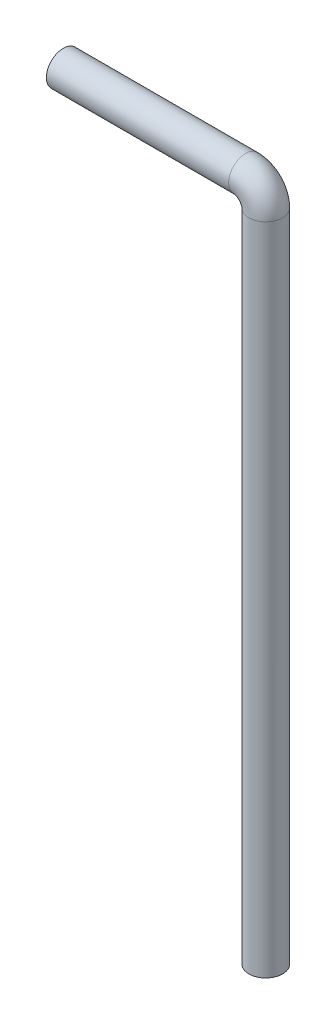
ISO-10303-21;
HEADER;
FILE_DESCRIPTION(('STEP AP214'),'2;1');
FILE_NAME('part.step','',(''),(''),'','','');
FILE_SCHEMA(('AUTOMOTIVE_DESIGN { 1 0 10303 214 1 1 1 1 }'));
ENDSEC;
DATA;
#1=APPLICATION_CONTEXT('core data for automotive mechanical design processes');
#2=APPLICATION_PROTOCOL_DEFINITION('international standard','automotive_design',2000,#1);
#3=PRODUCT_CONTEXT('',#1,'mechanical');
#4=PRODUCT('Part','Part','',(#3));
#5=PRODUCT_RELATED_PRODUCT_CATEGORY('part','',(#4));
#6=PRODUCT_DEFINITION_FORMATION('','',#4);
#7=PRODUCT_DEFINITION_CONTEXT('part definition',#1,'design');
#8=PRODUCT_DEFINITION('design','',#6,#7);
#9=PRODUCT_DEFINITION_SHAPE('','',#8);
#10=(LENGTH_UNIT() NAMED_UNIT(*) SI_UNIT(.MILLI.,.METRE.));
#11=(NAMED_UNIT(*) PLANE_ANGLE_UNIT() SI_UNIT($,.RADIAN.));
#12=(NAMED_UNIT(*) SI_UNIT($,.STERADIAN.) SOLID_ANGLE_UNIT());
#13=UNCERTAINTY_MEASURE_WITH_UNIT(LENGTH_MEASURE(1.E-05),#10,'distance_accuracy_value','');
#14=(GEOMETRIC_REPRESENTATION_CONTEXT(3) GLOBAL_UNCERTAINTY_ASSIGNED_CONTEXT((#13)) GLOBAL_UNIT_ASSIGNED_CONTEXT((#10,
#11,#12)) REPRESENTATION_CONTEXT('',''));
#15=CARTESIAN_POINT('',(0.,0.,0.));
#16=DIRECTION('',(0.,0.,1.));
#17=DIRECTION('',(1.,0.,0.));
#18=AXIS2_PLACEMENT_3D('',#15,#16,#17);
#19=CARTESIAN_POINT('',(0.,0.,0.));
#20=DIRECTION('',(1.,0.,0.));
#21=DIRECTION('',(0.,0.,-1.));
#22=AXIS2_PLACEMENT_3D('',#19,#20,#21);
#23=CYLINDRICAL_SURFACE('',#22,25.);
#24=CARTESIAN_POINT('',(270.,0.,0.));
#25=DIRECTION('',(1.,0.,0.));
#26=DIRECTION('',(0.,0.,-1.));
#27=AXIS2_PLACEMENT_3D('',#24,#25,#26);
#28=CIRCLE('',#27,25.);
#29=CARTESIAN_POINT('',(270.,25.,0.));
#30=VERTEX_POINT('',#29);
#31=EDGE_CURVE('E79',#30,#30,#28,.T.);
#32=ORIENTED_EDGE('',*,*,#31,.F.);
#33=EDGE_LOOP('',(#32));
#34=FACE_BOUND('',#33,.T.);
#35=CARTESIAN_POINT('',(0.,0.,0.));
#36=DIRECTION('',(1.,0.,0.));
#37=DIRECTION('',(0.,0.,-1.));
#38=AXIS2_PLACEMENT_3D('',#35,#36,#37);
#39=CIRCLE('',#38,25.);
#40=CARTESIAN_POINT('',(0.,0.,-25.));
#41=VERTEX_POINT('',#40);
#42=EDGE_CURVE('E48',#41,#41,#39,.T.);
#43=ORIENTED_EDGE('',*,*,#42,.T.);
#44=EDGE_LOOP('',(#43));
#45=FACE_BOUND('',#44,.T.);
#46=ADVANCED_FACE('F33',(#34,#45),#23,.T.);
#47=CARTESIAN_POINT('',(270.,-30.,0.));
#48=DIRECTION('',(0.,0.,-1.));
#49=DIRECTION('',(-1.,0.,0.));
#50=AXIS2_PLACEMENT_3D('',#47,#48,#49);
#51=TOROIDAL_SURFACE('',#50,30.,25.);
#52=CARTESIAN_POINT('',(300.,-30.,0.));
#53=DIRECTION('',(0.,-1.,0.));
#54=DIRECTION('',(0.,0.,-1.));
#55=AXIS2_PLACEMENT_3D('',#52,#53,#54);
#56=CIRCLE('',#55,25.);
#57=CARTESIAN_POINT('',(325.,-30.,0.));
#58=VERTEX_POINT('',#57);
#59=EDGE_CURVE('E37',#58,#58,#56,.T.);
#60=CARTESIAN_POINT('',(270.,-30.,0.));
#61=DIRECTION('',(0.,0.,-1.));
#62=DIRECTION('',(-1.,0.,0.));
#63=AXIS2_PLACEMENT_3D('',#60,#61,#62);
#64=CIRCLE('',#63,55.);
#65=EDGE_CURVE('',#30,#58,#64,.T.);
#66=ORIENTED_EDGE('',*,*,#31,.T.);
#67=ORIENTED_EDGE('',*,*,#59,.F.);
#68=ORIENTED_EDGE('',*,*,#65,.T.);
#69=ORIENTED_EDGE('',*,*,#65,.F.);
#70=EDGE_LOOP('',(#66,#68,#67,#69));
#71=FACE_BOUND('',#70,.T.);
#72=ADVANCED_FACE('F87',(#71),#51,.T.);
#73=CARTESIAN_POINT('',(300.,-30.,0.));
#74=DIRECTION('',(0.,-1.,0.));
#75=DIRECTION('',(1.,0.,0.));
#76=AXIS2_PLACEMENT_3D('',#73,#74,#75);
#77=CYLINDRICAL_SURFACE('',#76,25.);
#78=CARTESIAN_POINT('',(300.,-1000.,0.));
#79=DIRECTION('',(0.,-1.,0.));
#80=DIRECTION('',(0.,0.,-1.));
#81=AXIS2_PLACEMENT_3D('',#78,#79,#80);
#82=CIRCLE('',#81,25.);
#83=CARTESIAN_POINT('',(300.,-1000.,-25.));
#84=VERTEX_POINT('',#83);
#85=EDGE_CURVE('E53',#84,#84,#82,.T.);
#86=ORIENTED_EDGE('',*,*,#85,.F.);
#87=EDGE_LOOP('',(#86));
#88=FACE_BOUND('',#87,.T.);
#89=ORIENTED_EDGE('',*,*,#59,.T.);
#90=EDGE_LOOP('',(#89));
#91=FACE_BOUND('',#90,.T.);
#92=ADVANCED_FACE('F35',(#88,#91),#77,.T.);
#93=CARTESIAN_POINT('',(0.,0.,0.));
#94=DIRECTION('',(1.,0.,0.));
#95=DIRECTION('',(0.,0.,-1.));
#96=AXIS2_PLACEMENT_3D('',#93,#94,#95);
#97=PLANE('',#96);
#98=CARTESIAN_POINT('',(0.,0.,0.));
#99=DIRECTION('',(1.,0.,0.));
#100=DIRECTION('',(0.,0.,-1.));
#101=AXIS2_PLACEMENT_3D('',#98,#99,#100);
#102=CIRCLE('',#101,20.0521808539054);
#103=CARTESIAN_POINT('',(0.,0.,-20.0521808539054));
#104=VERTEX_POINT('',#103);
#105=EDGE_CURVE('E74',#104,#104,#102,.F.);
#106=ORIENTED_EDGE('',*,*,#105,.F.);
#107=EDGE_LOOP('',(#106));
#108=FACE_BOUND('',#107,.T.);
#109=ORIENTED_EDGE('',*,*,#42,.F.);
#110=EDGE_LOOP('',(#109));
#111=FACE_BOUND('',#110,.T.);
#112=ADVANCED_FACE('F93',(#108,#111),#97,.F.);
#113=CARTESIAN_POINT('',(300.,-1000.,0.));
#114=DIRECTION('',(0.,-1.,0.));
#115=DIRECTION('',(0.,0.,-1.));
#116=AXIS2_PLACEMENT_3D('',#113,#114,#115);
#117=PLANE('',#116);
#118=CARTESIAN_POINT('',(300.,-1000.,0.));
#119=DIRECTION('',(0.,-1.,0.));
#120=DIRECTION('',(0.,0.,-1.));
#121=AXIS2_PLACEMENT_3D('',#118,#119,#120);
#122=CIRCLE('',#121,20.0521808539054);
#123=CARTESIAN_POINT('',(300.,-1000.,-20.0521808539054));
#124=VERTEX_POINT('',#123);
#125=EDGE_CURVE('E11',#124,#124,#122,.F.);
#126=ORIENTED_EDGE('',*,*,#125,.T.);
#127=EDGE_LOOP('',(#126));
#128=FACE_BOUND('',#127,.T.);
#129=ORIENTED_EDGE('',*,*,#85,.T.);
#130=EDGE_LOOP('',(#129));
#131=FACE_BOUND('',#130,.T.);
#132=ADVANCED_FACE('F60',(#128,#131),#117,.T.);
#133=CARTESIAN_POINT('',(0.,0.,0.));
#134=DIRECTION('',(1.,0.,0.));
#135=DIRECTION('',(0.,0.,-1.));
#136=AXIS2_PLACEMENT_3D('',#133,#134,#135);
#137=CYLINDRICAL_SURFACE('',#136,20.0521808539054);
#138=CARTESIAN_POINT('',(270.,0.,0.));
#139=DIRECTION('',(1.,0.,0.));
#140=DIRECTION('',(0.,0.,-1.));
#141=AXIS2_PLACEMENT_3D('',#138,#139,#140);
#142=CIRCLE('',#141,20.0521808539054);
#143=CARTESIAN_POINT('',(270.,20.0521808539054,0.));
#144=VERTEX_POINT('',#143);
#145=EDGE_CURVE('E71',#144,#144,#142,.F.);
#146=ORIENTED_EDGE('',*,*,#145,.F.);
#147=EDGE_LOOP('',(#146));
#148=FACE_BOUND('',#147,.T.);
#149=ORIENTED_EDGE('',*,*,#105,.T.);
#150=EDGE_LOOP('',(#149));
#151=FACE_BOUND('',#150,.T.);
#152=ADVANCED_FACE('F101',(#148,#151),#137,.F.);
#153=CARTESIAN_POINT('',(270.,-30.,0.));
#154=DIRECTION('',(0.,0.,-1.));
#155=DIRECTION('',(-1.,0.,0.));
#156=AXIS2_PLACEMENT_3D('',#153,#154,#155);
#157=TOROIDAL_SURFACE('',#156,30.,20.0521808539054);
#158=CARTESIAN_POINT('',(300.,-30.,0.));
#159=DIRECTION('',(0.,-1.,0.));
#160=DIRECTION('',(0.,0.,-1.));
#161=AXIS2_PLACEMENT_3D('',#158,#159,#160);
#162=CIRCLE('',#161,20.0521808539054);
#163=CARTESIAN_POINT('',(320.052180853905,-30.,0.));
#164=VERTEX_POINT('',#163);
#165=EDGE_CURVE('E42',#164,#164,#162,.F.);
#166=CARTESIAN_POINT('',(270.,-30.,0.));
#167=DIRECTION('',(0.,0.,-1.));
#168=DIRECTION('',(-1.,0.,0.));
#169=AXIS2_PLACEMENT_3D('',#166,#167,#168);
#170=CIRCLE('',#169,50.0521808539054);
#171=EDGE_CURVE('',#144,#164,#170,.T.);
#172=ORIENTED_EDGE('',*,*,#145,.T.);
#173=ORIENTED_EDGE('',*,*,#165,.F.);
#174=ORIENTED_EDGE('',*,*,#171,.T.);
#175=ORIENTED_EDGE('',*,*,#171,.F.);
#176=EDGE_LOOP('',(#172,#174,#173,#175));
#177=FACE_BOUND('',#176,.T.);
#178=ADVANCED_FACE('F66',(#177),#157,.F.);
#179=CARTESIAN_POINT('',(300.,-30.,0.));
#180=DIRECTION('',(0.,-1.,0.));
#181=DIRECTION('',(1.,0.,0.));
#182=AXIS2_PLACEMENT_3D('',#179,#180,#181);
#183=CYLINDRICAL_SURFACE('',#182,20.0521808539054);
#184=ORIENTED_EDGE('',*,*,#125,.F.);
#185=EDGE_LOOP('',(#184));
#186=FACE_BOUND('',#185,.T.);
#187=ORIENTED_EDGE('',*,*,#165,.T.);
#188=EDGE_LOOP('',(#187));
#189=FACE_BOUND('',#188,.T.);
#190=ADVANCED_FACE('F63',(#186,#189),#183,.F.);
#191=CLOSED_SHELL('',(#46,#72,#92,#112,#132,#152,#178,#190));
#192=MANIFOLD_SOLID_BREP('B2',#191);
#193=ADVANCED_BREP_SHAPE_REPRESENTATION('',(#18,#192),#14);
#194=SHAPE_DEFINITION_REPRESENTATION(#9,#193);
ENDSEC;
END-ISO-10303-21;
